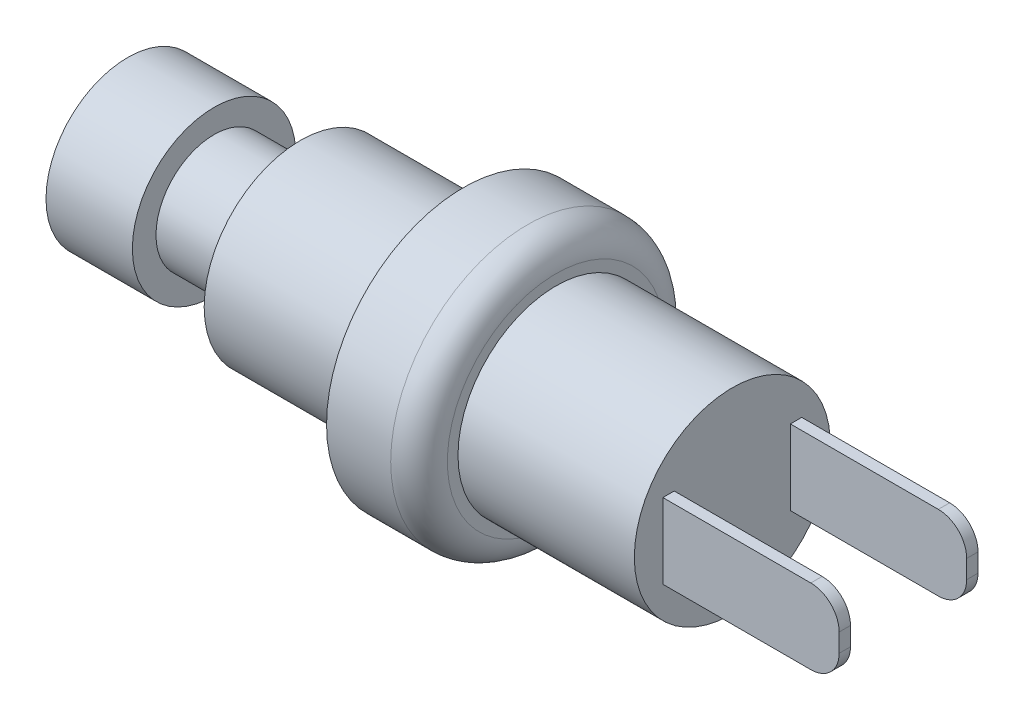
ISO-10303-21;
HEADER;
FILE_DESCRIPTION(('STEP AP214'),'2;1');
FILE_NAME('part.step','',(''),(''),'','','');
FILE_SCHEMA(('AUTOMOTIVE_DESIGN { 1 0 10303 214 1 1 1 1 }'));
ENDSEC;
DATA;
#1=APPLICATION_CONTEXT('core data for automotive mechanical design processes');
#2=APPLICATION_PROTOCOL_DEFINITION('international standard','automotive_design',2000,#1);
#3=PRODUCT_CONTEXT('',#1,'mechanical');
#4=PRODUCT('Part','Part','',(#3));
#5=PRODUCT_RELATED_PRODUCT_CATEGORY('part','',(#4));
#6=PRODUCT_DEFINITION_FORMATION('','',#4);
#7=PRODUCT_DEFINITION_CONTEXT('part definition',#1,'design');
#8=PRODUCT_DEFINITION('design','',#6,#7);
#9=PRODUCT_DEFINITION_SHAPE('','',#8);
#10=(LENGTH_UNIT() NAMED_UNIT(*) SI_UNIT(.MILLI.,.METRE.));
#11=(NAMED_UNIT(*) PLANE_ANGLE_UNIT() SI_UNIT($,.RADIAN.));
#12=(NAMED_UNIT(*) SI_UNIT($,.STERADIAN.) SOLID_ANGLE_UNIT());
#13=UNCERTAINTY_MEASURE_WITH_UNIT(LENGTH_MEASURE(1.E-05),#10,'distance_accuracy_value','');
#14=(GEOMETRIC_REPRESENTATION_CONTEXT(3) GLOBAL_UNCERTAINTY_ASSIGNED_CONTEXT((#13)) GLOBAL_UNIT_ASSIGNED_CONTEXT((#10,
#11,#12)) REPRESENTATION_CONTEXT('',''));
#15=CARTESIAN_POINT('',(0.,0.,0.));
#16=DIRECTION('',(0.,0.,1.));
#17=DIRECTION('',(1.,0.,0.));
#18=AXIS2_PLACEMENT_3D('',#15,#16,#17);
#19=CARTESIAN_POINT('',(25.1035387045972,0.,0.));
#20=DIRECTION('',(1.,0.,0.));
#21=DIRECTION('',(0.,0.,-1.));
#22=AXIS2_PLACEMENT_3D('',#19,#20,#21);
#23=PLANE('',#22);
#24=DIRECTION('',(0.,-1.,0.));
#25=VECTOR('',#24,1.);
#26=CARTESIAN_POINT('',(25.1035387045972,0.,2.05));
#27=LINE('',#26,#25);
#28=CARTESIAN_POINT('',(25.1035387045972,1.325,2.05));
#29=VERTEX_POINT('',#28);
#30=CARTESIAN_POINT('',(25.1035387045972,-1.325,2.05));
#31=VERTEX_POINT('',#30);
#32=EDGE_CURVE('E146',#29,#31,#27,.T.);
#33=ORIENTED_EDGE('',*,*,#32,.T.);
#34=DIRECTION('',(0.,0.,-1.));
#35=VECTOR('',#34,1.);
#36=CARTESIAN_POINT('',(25.1035387045972,-1.325,0.));
#37=LINE('',#36,#35);
#38=CARTESIAN_POINT('',(25.1035387045972,-1.325,2.45));
#39=VERTEX_POINT('',#38);
#40=EDGE_CURVE('E176',#39,#31,#37,.T.);
#41=ORIENTED_EDGE('',*,*,#40,.F.);
#42=DIRECTION('',(0.,-1.,0.));
#43=VECTOR('',#42,1.);
#44=CARTESIAN_POINT('',(25.1035387045972,0.,2.45));
#45=LINE('',#44,#43);
#46=CARTESIAN_POINT('',(25.1035387045972,1.325,2.45));
#47=VERTEX_POINT('',#46);
#48=EDGE_CURVE('E185',#47,#39,#45,.T.);
#49=ORIENTED_EDGE('',*,*,#48,.F.);
#50=DIRECTION('',(0.,0.,1.));
#51=VECTOR('',#50,1.);
#52=CARTESIAN_POINT('',(25.1035387045972,1.325,0.));
#53=LINE('',#52,#51);
#54=EDGE_CURVE('E182',#29,#47,#53,.T.);
#55=ORIENTED_EDGE('',*,*,#54,.F.);
#56=EDGE_LOOP('',(#33,#41,#49,#55));
#57=FACE_BOUND('',#56,.T.);
#58=CARTESIAN_POINT('',(25.1035387045972,0.,0.));
#59=DIRECTION('',(-1.,0.,0.));
#60=DIRECTION('',(0.,0.,1.));
#61=AXIS2_PLACEMENT_3D('',#58,#59,#60);
#62=CIRCLE('',#61,3.45787414617344);
#63=CARTESIAN_POINT('',(25.1035387045972,0.,3.45787414617344));
#64=VERTEX_POINT('',#63);
#65=EDGE_CURVE('E221',#64,#64,#62,.T.);
#66=ORIENTED_EDGE('',*,*,#65,.F.);
#67=EDGE_LOOP('',(#66));
#68=FACE_BOUND('',#67,.T.);
#69=DIRECTION('',(0.,-1.,0.));
#70=VECTOR('',#69,1.);
#71=CARTESIAN_POINT('',(25.1035387045972,0.,-2.05));
#72=LINE('',#71,#70);
#73=CARTESIAN_POINT('',(25.1035387045972,1.325,-2.05));
#74=VERTEX_POINT('',#73);
#75=CARTESIAN_POINT('',(25.1035387045972,-1.325,-2.05));
#76=VERTEX_POINT('',#75);
#77=EDGE_CURVE('E140',#74,#76,#72,.T.);
#78=ORIENTED_EDGE('',*,*,#77,.F.);
#79=DIRECTION('',(0.,0.,1.));
#80=VECTOR('',#79,1.);
#81=CARTESIAN_POINT('',(25.1035387045972,1.325,0.));
#82=LINE('',#81,#80);
#83=CARTESIAN_POINT('',(25.1035387045972,1.325,-2.45));
#84=VERTEX_POINT('',#83);
#85=EDGE_CURVE('E150',#84,#74,#82,.T.);
#86=ORIENTED_EDGE('',*,*,#85,.F.);
#87=DIRECTION('',(0.,1.,0.));
#88=VECTOR('',#87,1.);
#89=CARTESIAN_POINT('',(25.1035387045972,0.,-2.45));
#90=LINE('',#89,#88);
#91=CARTESIAN_POINT('',(25.1035387045972,-1.325,-2.45));
#92=VERTEX_POINT('',#91);
#93=EDGE_CURVE('E161',#92,#84,#90,.T.);
#94=ORIENTED_EDGE('',*,*,#93,.F.);
#95=DIRECTION('',(0.,0.,-1.));
#96=VECTOR('',#95,1.);
#97=CARTESIAN_POINT('',(25.1035387045972,-1.325,0.));
#98=LINE('',#97,#96);
#99=EDGE_CURVE('E159',#76,#92,#98,.T.);
#100=ORIENTED_EDGE('',*,*,#99,.F.);
#101=EDGE_LOOP('',(#78,#86,#94,#100));
#102=FACE_BOUND('',#101,.T.);
#103=ADVANCED_FACE('F46',(#57,#68,#102),#23,.T.);
#104=CARTESIAN_POINT('',(0.,0.,0.));
#105=DIRECTION('',(-1.,0.,0.));
#106=DIRECTION('',(0.,0.,1.));
#107=AXIS2_PLACEMENT_3D('',#104,#105,#106);
#108=CYLINDRICAL_SURFACE('',#107,3.45787414617344);
#109=ORIENTED_EDGE('',*,*,#65,.T.);
#110=EDGE_LOOP('',(#109));
#111=FACE_BOUND('',#110,.T.);
#112=CARTESIAN_POINT('',(18.8805387045972,0.,0.));
#113=DIRECTION('',(-1.,0.,0.));
#114=DIRECTION('',(0.,0.,1.));
#115=AXIS2_PLACEMENT_3D('',#112,#113,#114);
#116=CIRCLE('',#115,3.45787414617344);
#117=CARTESIAN_POINT('',(18.8805387045972,0.,3.45787414617344));
#118=VERTEX_POINT('',#117);
#119=EDGE_CURVE('E218',#118,#118,#116,.T.);
#120=ORIENTED_EDGE('',*,*,#119,.F.);
#121=EDGE_LOOP('',(#120));
#122=FACE_BOUND('',#121,.T.);
#123=ADVANCED_FACE('F292',(#111,#122),#108,.T.);
#124=CARTESIAN_POINT('',(18.8805387045972,0.,0.));
#125=DIRECTION('',(1.,0.,0.));
#126=DIRECTION('',(0.,0.,-1.));
#127=AXIS2_PLACEMENT_3D('',#124,#125,#126);
#128=PLANE('',#127);
#129=CARTESIAN_POINT('',(18.8805387045972,0.,0.));
#130=DIRECTION('',(1.,0.,0.));
#131=DIRECTION('',(0.,0.,-1.));
#132=AXIS2_PLACEMENT_3D('',#129,#130,#131);
#133=CIRCLE('',#132,3.832);
#134=CARTESIAN_POINT('',(18.8805387045972,0.,-3.832));
#135=VERTEX_POINT('',#134);
#136=EDGE_CURVE('E227',#135,#135,#133,.T.);
#137=ORIENTED_EDGE('',*,*,#136,.T.);
#138=EDGE_LOOP('',(#137));
#139=FACE_BOUND('',#138,.T.);
#140=ORIENTED_EDGE('',*,*,#119,.T.);
#141=EDGE_LOOP('',(#140));
#142=FACE_BOUND('',#141,.T.);
#143=ADVANCED_FACE('F297',(#139,#142),#128,.T.);
#144=CARTESIAN_POINT('',(0.,0.,0.));
#145=DIRECTION('',(-1.,0.,0.));
#146=DIRECTION('',(0.,0.,1.));
#147=AXIS2_PLACEMENT_3D('',#144,#145,#146);
#148=CYLINDRICAL_SURFACE('',#147,4.832);
#149=CARTESIAN_POINT('',(17.8805387045972,0.,0.));
#150=DIRECTION('',(1.,0.,0.));
#151=DIRECTION('',(0.,0.,-1.));
#152=AXIS2_PLACEMENT_3D('',#149,#150,#151);
#153=CIRCLE('',#152,4.832);
#154=CARTESIAN_POINT('',(17.8805387045972,0.,-4.832));
#155=VERTEX_POINT('',#154);
#156=EDGE_CURVE('E224',#155,#155,#153,.F.);
#157=ORIENTED_EDGE('',*,*,#156,.T.);
#158=EDGE_LOOP('',(#157));
#159=FACE_BOUND('',#158,.T.);
#160=CARTESIAN_POINT('',(15.6165387045972,0.,0.));
#161=DIRECTION('',(-1.,0.,0.));
#162=DIRECTION('',(0.,0.,1.));
#163=AXIS2_PLACEMENT_3D('',#160,#161,#162);
#164=CIRCLE('',#163,4.832);
#165=CARTESIAN_POINT('',(15.6165387045972,0.,4.832));
#166=VERTEX_POINT('',#165);
#167=EDGE_CURVE('E215',#166,#166,#164,.T.);
#168=ORIENTED_EDGE('',*,*,#167,.F.);
#169=EDGE_LOOP('',(#168));
#170=FACE_BOUND('',#169,.T.);
#171=ADVANCED_FACE('F438',(#159,#170),#148,.T.);
#172=CARTESIAN_POINT('',(15.6165387045972,0.,0.));
#173=DIRECTION('',(-1.,0.,0.));
#174=DIRECTION('',(0.,0.,1.));
#175=AXIS2_PLACEMENT_3D('',#172,#173,#174);
#176=PLANE('',#175);
#177=ORIENTED_EDGE('',*,*,#167,.T.);
#178=EDGE_LOOP('',(#177));
#179=FACE_BOUND('',#178,.T.);
#180=CARTESIAN_POINT('',(15.6165387045972,0.,0.));
#181=DIRECTION('',(-1.,0.,0.));
#182=DIRECTION('',(0.,0.,1.));
#183=AXIS2_PLACEMENT_3D('',#180,#181,#182);
#184=CIRCLE('',#183,3.397);
#185=CARTESIAN_POINT('',(15.6165387045972,0.,3.397));
#186=VERTEX_POINT('',#185);
#187=EDGE_CURVE('E212',#186,#186,#184,.T.);
#188=ORIENTED_EDGE('',*,*,#187,.F.);
#189=EDGE_LOOP('',(#188));
#190=FACE_BOUND('',#189,.T.);
#191=ADVANCED_FACE('F443',(#179,#190),#176,.T.);
#192=CARTESIAN_POINT('',(0.,0.,0.));
#193=DIRECTION('',(-1.,0.,0.));
#194=DIRECTION('',(0.,0.,1.));
#195=AXIS2_PLACEMENT_3D('',#192,#193,#194);
#196=CYLINDRICAL_SURFACE('',#195,3.397);
#197=ORIENTED_EDGE('',*,*,#187,.T.);
#198=EDGE_LOOP('',(#197));
#199=FACE_BOUND('',#198,.T.);
#200=CARTESIAN_POINT('',(9.86353870459718,0.,0.));
#201=DIRECTION('',(-1.,0.,0.));
#202=DIRECTION('',(0.,0.,1.));
#203=AXIS2_PLACEMENT_3D('',#200,#201,#202);
#204=CIRCLE('',#203,3.397);
#205=CARTESIAN_POINT('',(9.86353870459718,0.,3.397));
#206=VERTEX_POINT('',#205);
#207=EDGE_CURVE('E209',#206,#206,#204,.T.);
#208=ORIENTED_EDGE('',*,*,#207,.F.);
#209=EDGE_LOOP('',(#208));
#210=FACE_BOUND('',#209,.T.);
#211=ADVANCED_FACE('F508',(#199,#210),#196,.T.);
#212=CARTESIAN_POINT('',(9.86353870459718,0.,0.));
#213=DIRECTION('',(-1.,0.,0.));
#214=DIRECTION('',(0.,0.,1.));
#215=AXIS2_PLACEMENT_3D('',#212,#213,#214);
#216=PLANE('',#215);
#217=ORIENTED_EDGE('',*,*,#207,.T.);
#218=EDGE_LOOP('',(#217));
#219=FACE_BOUND('',#218,.T.);
#220=CARTESIAN_POINT('',(9.86353870459718,0.,0.));
#221=DIRECTION('',(-1.,0.,0.));
#222=DIRECTION('',(0.,0.,1.));
#223=AXIS2_PLACEMENT_3D('',#220,#221,#222);
#224=CIRCLE('',#223,2.04998570622853);
#225=CARTESIAN_POINT('',(9.86353870459718,0.,2.04998570622853));
#226=VERTEX_POINT('',#225);
#227=EDGE_CURVE('E206',#226,#226,#224,.T.);
#228=ORIENTED_EDGE('',*,*,#227,.F.);
#229=EDGE_LOOP('',(#228));
#230=FACE_BOUND('',#229,.T.);
#231=ADVANCED_FACE('F497',(#219,#230),#216,.T.);
#232=CARTESIAN_POINT('',(0.,0.,0.));
#233=DIRECTION('',(-1.,0.,0.));
#234=DIRECTION('',(0.,0.,1.));
#235=AXIS2_PLACEMENT_3D('',#232,#233,#234);
#236=CYLINDRICAL_SURFACE('',#235,2.04998570622853);
#237=ORIENTED_EDGE('',*,*,#227,.T.);
#238=EDGE_LOOP('',(#237));
#239=FACE_BOUND('',#238,.T.);
#240=CARTESIAN_POINT('',(6.81553870459718,0.,0.));
#241=DIRECTION('',(-1.,0.,0.));
#242=DIRECTION('',(0.,0.,1.));
#243=AXIS2_PLACEMENT_3D('',#240,#241,#242);
#244=CIRCLE('',#243,2.04998570622853);
#245=CARTESIAN_POINT('',(6.81553870459718,0.,2.04998570622853));
#246=VERTEX_POINT('',#245);
#247=EDGE_CURVE('E203',#246,#246,#244,.T.);
#248=ORIENTED_EDGE('',*,*,#247,.F.);
#249=EDGE_LOOP('',(#248));
#250=FACE_BOUND('',#249,.T.);
#251=ADVANCED_FACE('F487',(#239,#250),#236,.T.);
#252=CARTESIAN_POINT('',(6.81553870459718,0.,0.));
#253=DIRECTION('',(1.,0.,0.));
#254=DIRECTION('',(0.,0.,-1.));
#255=AXIS2_PLACEMENT_3D('',#252,#253,#254);
#256=PLANE('',#255);
#257=ORIENTED_EDGE('',*,*,#247,.T.);
#258=EDGE_LOOP('',(#257));
#259=FACE_BOUND('',#258,.T.);
#260=CARTESIAN_POINT('',(6.81553870459718,0.,0.));
#261=DIRECTION('',(-1.,0.,0.));
#262=DIRECTION('',(0.,0.,1.));
#263=AXIS2_PLACEMENT_3D('',#260,#261,#262);
#264=CIRCLE('',#263,2.883);
#265=CARTESIAN_POINT('',(6.81553870459718,0.,2.883));
#266=VERTEX_POINT('',#265);
#267=EDGE_CURVE('E200',#266,#266,#264,.T.);
#268=ORIENTED_EDGE('',*,*,#267,.F.);
#269=EDGE_LOOP('',(#268));
#270=FACE_BOUND('',#269,.T.);
#271=ADVANCED_FACE('F476',(#259,#270),#256,.T.);
#272=CARTESIAN_POINT('',(0.,0.,0.));
#273=DIRECTION('',(-1.,0.,0.));
#274=DIRECTION('',(0.,0.,1.));
#275=AXIS2_PLACEMENT_3D('',#272,#273,#274);
#276=CYLINDRICAL_SURFACE('',#275,2.883);
#277=ORIENTED_EDGE('',*,*,#267,.T.);
#278=EDGE_LOOP('',(#277));
#279=FACE_BOUND('',#278,.T.);
#280=CARTESIAN_POINT('',(3.76753870459718,0.,0.));
#281=DIRECTION('',(-1.,0.,0.));
#282=DIRECTION('',(0.,0.,1.));
#283=AXIS2_PLACEMENT_3D('',#280,#281,#282);
#284=CIRCLE('',#283,2.883);
#285=CARTESIAN_POINT('',(3.76753870459718,0.,2.883));
#286=VERTEX_POINT('',#285);
#287=EDGE_CURVE('E197',#286,#286,#284,.T.);
#288=ORIENTED_EDGE('',*,*,#287,.F.);
#289=EDGE_LOOP('',(#288));
#290=FACE_BOUND('',#289,.T.);
#291=ADVANCED_FACE('F465',(#279,#290),#276,.T.);
#292=CARTESIAN_POINT('',(3.76753870459718,0.,0.));
#293=DIRECTION('',(-1.,0.,0.));
#294=DIRECTION('',(0.,0.,1.));
#295=AXIS2_PLACEMENT_3D('',#292,#293,#294);
#296=PLANE('',#295);
#297=ORIENTED_EDGE('',*,*,#287,.T.);
#298=EDGE_LOOP('',(#297));
#299=FACE_BOUND('',#298,.T.);
#300=ADVANCED_FACE('F304',(#299),#296,.T.);
#301=CARTESIAN_POINT('',(17.8805387045972,0.,0.));
#302=DIRECTION('',(1.,0.,0.));
#303=DIRECTION('',(0.,0.,-1.));
#304=AXIS2_PLACEMENT_3D('',#301,#302,#303);
#305=TOROIDAL_SURFACE('',#304,3.832,1.);
#306=ORIENTED_EDGE('',*,*,#136,.F.);
#307=EDGE_LOOP('',(#306));
#308=FACE_BOUND('',#307,.T.);
#309=ORIENTED_EDGE('',*,*,#156,.F.);
#310=EDGE_LOOP('',(#309));
#311=FACE_BOUND('',#310,.T.);
#312=ADVANCED_FACE('F289',(#308,#311),#305,.T.);
#313=CARTESIAN_POINT('',(31.3235387045972,0.,2.05));
#314=DIRECTION('',(0.,0.,-1.));
#315=DIRECTION('',(-1.,0.,0.));
#316=AXIS2_PLACEMENT_3D('',#313,#314,#315);
#317=PLANE('',#316);
#318=DIRECTION('',(0.,-1.,0.));
#319=VECTOR('',#318,1.);
#320=CARTESIAN_POINT('',(31.3235387045972,0.,2.05));
#321=LINE('',#320,#319);
#322=CARTESIAN_POINT('',(31.3235387045972,0.325,2.05));
#323=VERTEX_POINT('',#322);
#324=CARTESIAN_POINT('',(31.3235387045972,-0.325,2.05));
#325=VERTEX_POINT('',#324);
#326=EDGE_CURVE('E172',#323,#325,#321,.T.);
#327=ORIENTED_EDGE('',*,*,#326,.T.);
#328=CARTESIAN_POINT('',(30.3235387045972,-0.325,2.05));
#329=DIRECTION('',(0.,0.,-1.));
#330=DIRECTION('',(-1.,0.,0.));
#331=AXIS2_PLACEMENT_3D('',#328,#329,#330);
#332=CIRCLE('',#331,1.);
#333=CARTESIAN_POINT('',(30.3235387045972,-1.325,2.05));
#334=VERTEX_POINT('',#333);
#335=EDGE_CURVE('E255',#325,#334,#332,.T.);
#336=ORIENTED_EDGE('',*,*,#335,.T.);
#337=DIRECTION('',(-1.,0.,0.));
#338=VECTOR('',#337,1.);
#339=CARTESIAN_POINT('',(31.3235387045972,-1.325,2.05));
#340=LINE('',#339,#338);
#341=EDGE_CURVE('E179',#334,#31,#340,.T.);
#342=ORIENTED_EDGE('',*,*,#341,.T.);
#343=ORIENTED_EDGE('',*,*,#32,.F.);
#344=DIRECTION('',(-1.,0.,0.));
#345=VECTOR('',#344,1.);
#346=CARTESIAN_POINT('',(31.3235387045972,1.325,2.05));
#347=LINE('',#346,#345);
#348=CARTESIAN_POINT('',(30.3235387045972,1.325,2.05));
#349=VERTEX_POINT('',#348);
#350=EDGE_CURVE('E195',#349,#29,#347,.T.);
#351=ORIENTED_EDGE('',*,*,#350,.F.);
#352=CARTESIAN_POINT('',(30.3235387045972,0.325,2.05));
#353=DIRECTION('',(0.,0.,-1.));
#354=DIRECTION('',(-1.,0.,0.));
#355=AXIS2_PLACEMENT_3D('',#352,#353,#354);
#356=CIRCLE('',#355,1.);
#357=EDGE_CURVE('E253',#349,#323,#356,.T.);
#358=ORIENTED_EDGE('',*,*,#357,.T.);
#359=EDGE_LOOP('',(#327,#336,#342,#343,#351,#358));
#360=FACE_BOUND('',#359,.T.);
#361=ADVANCED_FACE('F268',(#360),#317,.T.);
#362=CARTESIAN_POINT('',(31.3235387045972,1.325,0.));
#363=DIRECTION('',(0.,-1.,0.));
#364=DIRECTION('',(0.,0.,-1.));
#365=AXIS2_PLACEMENT_3D('',#362,#363,#364);
#366=PLANE('',#365);
#367=DIRECTION('',(-1.,0.,0.));
#368=VECTOR('',#367,1.);
#369=CARTESIAN_POINT('',(31.3235387045972,1.325,2.45));
#370=LINE('',#369,#368);
#371=CARTESIAN_POINT('',(30.3235387045972,1.325,2.45));
#372=VERTEX_POINT('',#371);
#373=EDGE_CURVE('E193',#372,#47,#370,.T.);
#374=ORIENTED_EDGE('',*,*,#373,.F.);
#375=DIRECTION('',(0.,0.,1.));
#376=VECTOR('',#375,1.);
#377=CARTESIAN_POINT('',(30.3235387045972,1.325,2.05));
#378=LINE('',#377,#376);
#379=EDGE_CURVE('E13',#372,#349,#378,.F.);
#380=ORIENTED_EDGE('',*,*,#379,.T.);
#381=ORIENTED_EDGE('',*,*,#350,.T.);
#382=ORIENTED_EDGE('',*,*,#54,.T.);
#383=EDGE_LOOP('',(#374,#380,#381,#382));
#384=FACE_BOUND('',#383,.T.);
#385=ADVANCED_FACE('F281',(#384),#366,.F.);
#386=CARTESIAN_POINT('',(31.3235387045972,0.,2.45));
#387=DIRECTION('',(0.,0.,-1.));
#388=DIRECTION('',(-1.,0.,0.));
#389=AXIS2_PLACEMENT_3D('',#386,#387,#388);
#390=PLANE('',#389);
#391=DIRECTION('',(-1.,0.,0.));
#392=VECTOR('',#391,1.);
#393=CARTESIAN_POINT('',(31.3235387045972,-1.325,2.45));
#394=LINE('',#393,#392);
#395=CARTESIAN_POINT('',(30.3235387045972,-1.325,2.45));
#396=VERTEX_POINT('',#395);
#397=EDGE_CURVE('E191',#396,#39,#394,.T.);
#398=ORIENTED_EDGE('',*,*,#397,.F.);
#399=CARTESIAN_POINT('',(30.3235387045972,-0.325,2.45));
#400=DIRECTION('',(0.,0.,-1.));
#401=DIRECTION('',(-1.,0.,0.));
#402=AXIS2_PLACEMENT_3D('',#399,#400,#401);
#403=CIRCLE('',#402,1.);
#404=CARTESIAN_POINT('',(31.3235387045972,-0.325,2.45));
#405=VERTEX_POINT('',#404);
#406=EDGE_CURVE('E54',#396,#405,#403,.F.);
#407=ORIENTED_EDGE('',*,*,#406,.T.);
#408=DIRECTION('',(0.,-1.,0.));
#409=VECTOR('',#408,1.);
#410=CARTESIAN_POINT('',(31.3235387045972,0.,2.45));
#411=LINE('',#410,#409);
#412=CARTESIAN_POINT('',(31.3235387045972,0.325,2.45));
#413=VERTEX_POINT('',#412);
#414=EDGE_CURVE('E175',#413,#405,#411,.T.);
#415=ORIENTED_EDGE('',*,*,#414,.F.);
#416=CARTESIAN_POINT('',(30.3235387045972,0.325,2.45));
#417=DIRECTION('',(0.,0.,-1.));
#418=DIRECTION('',(-1.,0.,0.));
#419=AXIS2_PLACEMENT_3D('',#416,#417,#418);
#420=CIRCLE('',#419,1.);
#421=EDGE_CURVE('E61',#413,#372,#420,.F.);
#422=ORIENTED_EDGE('',*,*,#421,.T.);
#423=ORIENTED_EDGE('',*,*,#373,.T.);
#424=ORIENTED_EDGE('',*,*,#48,.T.);
#425=EDGE_LOOP('',(#398,#407,#415,#422,#423,#424));
#426=FACE_BOUND('',#425,.T.);
#427=ADVANCED_FACE('F259',(#426),#390,.F.);
#428=CARTESIAN_POINT('',(31.3235387045972,-1.325,0.));
#429=DIRECTION('',(0.,1.,0.));
#430=DIRECTION('',(0.,0.,1.));
#431=AXIS2_PLACEMENT_3D('',#428,#429,#430);
#432=PLANE('',#431);
#433=ORIENTED_EDGE('',*,*,#341,.F.);
#434=DIRECTION('',(0.,0.,-1.));
#435=VECTOR('',#434,1.);
#436=CARTESIAN_POINT('',(30.3235387045972,-1.325,2.45));
#437=LINE('',#436,#435);
#438=EDGE_CURVE('E69',#334,#396,#437,.F.);
#439=ORIENTED_EDGE('',*,*,#438,.T.);
#440=ORIENTED_EDGE('',*,*,#397,.T.);
#441=ORIENTED_EDGE('',*,*,#40,.T.);
#442=EDGE_LOOP('',(#433,#439,#440,#441));
#443=FACE_BOUND('',#442,.T.);
#444=ADVANCED_FACE('F270',(#443),#432,.F.);
#445=CARTESIAN_POINT('',(31.3235387045972,0.,0.));
#446=DIRECTION('',(1.,0.,0.));
#447=DIRECTION('',(0.,0.,-1.));
#448=AXIS2_PLACEMENT_3D('',#445,#446,#447);
#449=PLANE('',#448);
#450=ORIENTED_EDGE('',*,*,#414,.T.);
#451=DIRECTION('',(0.,0.,-1.));
#452=VECTOR('',#451,1.);
#453=CARTESIAN_POINT('',(31.3235387045972,-0.325,2.05));
#454=LINE('',#453,#452);
#455=EDGE_CURVE('E250',#405,#325,#454,.T.);
#456=ORIENTED_EDGE('',*,*,#455,.T.);
#457=ORIENTED_EDGE('',*,*,#326,.F.);
#458=DIRECTION('',(0.,0.,1.));
#459=VECTOR('',#458,1.);
#460=CARTESIAN_POINT('',(31.3235387045972,0.325,2.45));
#461=LINE('',#460,#459);
#462=EDGE_CURVE('E247',#323,#413,#461,.T.);
#463=ORIENTED_EDGE('',*,*,#462,.T.);
#464=EDGE_LOOP('',(#450,#456,#457,#463));
#465=FACE_BOUND('',#464,.T.);
#466=ADVANCED_FACE('F263',(#465),#449,.T.);
#467=CARTESIAN_POINT('',(31.3235387045972,1.325,0.));
#468=DIRECTION('',(0.,-1.,0.));
#469=DIRECTION('',(0.,0.,-1.));
#470=AXIS2_PLACEMENT_3D('',#467,#468,#469);
#471=PLANE('',#470);
#472=DIRECTION('',(-1.,0.,0.));
#473=VECTOR('',#472,1.);
#474=CARTESIAN_POINT('',(31.3235387045972,1.325,-2.05));
#475=LINE('',#474,#473);
#476=CARTESIAN_POINT('',(30.3235387045972,1.325,-2.05));
#477=VERTEX_POINT('',#476);
#478=EDGE_CURVE('E135',#477,#74,#475,.T.);
#479=ORIENTED_EDGE('',*,*,#478,.F.);
#480=DIRECTION('',(0.,0.,1.));
#481=VECTOR('',#480,1.);
#482=CARTESIAN_POINT('',(30.3235387045972,1.325,-2.45));
#483=LINE('',#482,#481);
#484=CARTESIAN_POINT('',(30.3235387045972,1.325,-2.45));
#485=VERTEX_POINT('',#484);
#486=EDGE_CURVE('E245',#477,#485,#483,.F.);
#487=ORIENTED_EDGE('',*,*,#486,.T.);
#488=DIRECTION('',(-1.,0.,0.));
#489=VECTOR('',#488,1.);
#490=CARTESIAN_POINT('',(31.3235387045972,1.325,-2.45));
#491=LINE('',#490,#489);
#492=EDGE_CURVE('E153',#485,#84,#491,.T.);
#493=ORIENTED_EDGE('',*,*,#492,.T.);
#494=ORIENTED_EDGE('',*,*,#85,.T.);
#495=EDGE_LOOP('',(#479,#487,#493,#494));
#496=FACE_BOUND('',#495,.T.);
#497=ADVANCED_FACE('F151',(#496),#471,.F.);
#498=CARTESIAN_POINT('',(31.3235387045972,0.,-2.05));
#499=DIRECTION('',(0.,0.,-1.));
#500=DIRECTION('',(-1.,0.,0.));
#501=AXIS2_PLACEMENT_3D('',#498,#499,#500);
#502=PLANE('',#501);
#503=DIRECTION('',(-1.,0.,0.));
#504=VECTOR('',#503,1.);
#505=CARTESIAN_POINT('',(31.3235387045972,-1.325,-2.05));
#506=LINE('',#505,#504);
#507=CARTESIAN_POINT('',(30.3235387045972,-1.325,-2.05));
#508=VERTEX_POINT('',#507);
#509=EDGE_CURVE('E147',#508,#76,#506,.T.);
#510=ORIENTED_EDGE('',*,*,#509,.F.);
#511=CARTESIAN_POINT('',(30.3235387045972,-0.325,-2.05));
#512=DIRECTION('',(0.,0.,-1.));
#513=DIRECTION('',(-1.,0.,0.));
#514=AXIS2_PLACEMENT_3D('',#511,#512,#513);
#515=CIRCLE('',#514,1.);
#516=CARTESIAN_POINT('',(31.3235387045972,-0.325,-2.05));
#517=VERTEX_POINT('',#516);
#518=EDGE_CURVE('E243',#508,#517,#515,.F.);
#519=ORIENTED_EDGE('',*,*,#518,.T.);
#520=DIRECTION('',(0.,-1.,0.));
#521=VECTOR('',#520,1.);
#522=CARTESIAN_POINT('',(31.3235387045972,0.,-2.05));
#523=LINE('',#522,#521);
#524=CARTESIAN_POINT('',(31.3235387045972,0.325,-2.05));
#525=VERTEX_POINT('',#524);
#526=EDGE_CURVE('E166',#525,#517,#523,.T.);
#527=ORIENTED_EDGE('',*,*,#526,.F.);
#528=CARTESIAN_POINT('',(30.3235387045972,0.325,-2.05));
#529=DIRECTION('',(0.,0.,-1.));
#530=DIRECTION('',(-1.,0.,0.));
#531=AXIS2_PLACEMENT_3D('',#528,#529,#530);
#532=CIRCLE('',#531,1.);
#533=EDGE_CURVE('E143',#525,#477,#532,.F.);
#534=ORIENTED_EDGE('',*,*,#533,.T.);
#535=ORIENTED_EDGE('',*,*,#478,.T.);
#536=ORIENTED_EDGE('',*,*,#77,.T.);
#537=EDGE_LOOP('',(#510,#519,#527,#534,#535,#536));
#538=FACE_BOUND('',#537,.T.);
#539=ADVANCED_FACE('F138',(#538),#502,.F.);
#540=CARTESIAN_POINT('',(31.3235387045972,-1.325,0.));
#541=DIRECTION('',(0.,1.,0.));
#542=DIRECTION('',(0.,0.,1.));
#543=AXIS2_PLACEMENT_3D('',#540,#541,#542);
#544=PLANE('',#543);
#545=DIRECTION('',(-1.,0.,0.));
#546=VECTOR('',#545,1.);
#547=CARTESIAN_POINT('',(31.3235387045972,-1.325,-2.45));
#548=LINE('',#547,#546);
#549=CARTESIAN_POINT('',(30.3235387045972,-1.325,-2.45));
#550=VERTEX_POINT('',#549);
#551=EDGE_CURVE('E168',#550,#92,#548,.T.);
#552=ORIENTED_EDGE('',*,*,#551,.F.);
#553=DIRECTION('',(0.,0.,-1.));
#554=VECTOR('',#553,1.);
#555=CARTESIAN_POINT('',(30.3235387045972,-1.325,-2.05));
#556=LINE('',#555,#554);
#557=EDGE_CURVE('E240',#550,#508,#556,.F.);
#558=ORIENTED_EDGE('',*,*,#557,.T.);
#559=ORIENTED_EDGE('',*,*,#509,.T.);
#560=ORIENTED_EDGE('',*,*,#99,.T.);
#561=EDGE_LOOP('',(#552,#558,#559,#560));
#562=FACE_BOUND('',#561,.T.);
#563=ADVANCED_FACE('F355',(#562),#544,.F.);
#564=CARTESIAN_POINT('',(31.3235387045972,0.,-2.45));
#565=DIRECTION('',(0.,0.,1.));
#566=DIRECTION('',(1.,0.,0.));
#567=AXIS2_PLACEMENT_3D('',#564,#565,#566);
#568=PLANE('',#567);
#569=DIRECTION('',(0.,1.,0.));
#570=VECTOR('',#569,1.);
#571=CARTESIAN_POINT('',(31.3235387045972,0.,-2.45));
#572=LINE('',#571,#570);
#573=CARTESIAN_POINT('',(31.3235387045972,-0.325,-2.45));
#574=VERTEX_POINT('',#573);
#575=CARTESIAN_POINT('',(31.3235387045972,0.325,-2.45));
#576=VERTEX_POINT('',#575);
#577=EDGE_CURVE('E169',#574,#576,#572,.T.);
#578=ORIENTED_EDGE('',*,*,#577,.F.);
#579=CARTESIAN_POINT('',(30.3235387045972,-0.325,-2.45));
#580=DIRECTION('',(0.,0.,1.));
#581=DIRECTION('',(1.,0.,0.));
#582=AXIS2_PLACEMENT_3D('',#579,#580,#581);
#583=CIRCLE('',#582,1.);
#584=EDGE_CURVE('E238',#574,#550,#583,.F.);
#585=ORIENTED_EDGE('',*,*,#584,.T.);
#586=ORIENTED_EDGE('',*,*,#551,.T.);
#587=ORIENTED_EDGE('',*,*,#93,.T.);
#588=ORIENTED_EDGE('',*,*,#492,.F.);
#589=CARTESIAN_POINT('',(30.3235387045972,0.325,-2.45));
#590=DIRECTION('',(0.,0.,1.));
#591=DIRECTION('',(1.,0.,0.));
#592=AXIS2_PLACEMENT_3D('',#589,#590,#591);
#593=CIRCLE('',#592,1.);
#594=EDGE_CURVE('E236',#485,#576,#593,.F.);
#595=ORIENTED_EDGE('',*,*,#594,.T.);
#596=EDGE_LOOP('',(#578,#585,#586,#587,#588,#595));
#597=FACE_BOUND('',#596,.T.);
#598=ADVANCED_FACE('F345',(#597),#568,.F.);
#599=CARTESIAN_POINT('',(31.3235387045972,0.,0.));
#600=DIRECTION('',(1.,0.,0.));
#601=DIRECTION('',(0.,0.,-1.));
#602=AXIS2_PLACEMENT_3D('',#599,#600,#601);
#603=PLANE('',#602);
#604=ORIENTED_EDGE('',*,*,#526,.T.);
#605=DIRECTION('',(0.,0.,-1.));
#606=VECTOR('',#605,1.);
#607=CARTESIAN_POINT('',(31.3235387045972,-0.325,-2.45));
#608=LINE('',#607,#606);
#609=EDGE_CURVE('E233',#517,#574,#608,.T.);
#610=ORIENTED_EDGE('',*,*,#609,.T.);
#611=ORIENTED_EDGE('',*,*,#577,.T.);
#612=DIRECTION('',(0.,0.,1.));
#613=VECTOR('',#612,1.);
#614=CARTESIAN_POINT('',(31.3235387045972,0.325,-2.05));
#615=LINE('',#614,#613);
#616=EDGE_CURVE('E230',#576,#525,#615,.T.);
#617=ORIENTED_EDGE('',*,*,#616,.T.);
#618=EDGE_LOOP('',(#604,#610,#611,#617));
#619=FACE_BOUND('',#618,.T.);
#620=ADVANCED_FACE('F310',(#619),#603,.T.);
#621=CARTESIAN_POINT('',(30.3235387045972,-0.325,0.));
#622=DIRECTION('',(0.,0.,1.));
#623=DIRECTION('',(0.,-1.,0.));
#624=AXIS2_PLACEMENT_3D('',#621,#622,#623);
#625=CYLINDRICAL_SURFACE('',#624,1.);
#626=ORIENTED_EDGE('',*,*,#518,.F.);
#627=ORIENTED_EDGE('',*,*,#557,.F.);
#628=ORIENTED_EDGE('',*,*,#584,.F.);
#629=ORIENTED_EDGE('',*,*,#609,.F.);
#630=EDGE_LOOP('',(#626,#627,#628,#629));
#631=FACE_BOUND('',#630,.T.);
#632=ADVANCED_FACE('F306',(#631),#625,.T.);
#633=CARTESIAN_POINT('',(30.3235387045972,0.325,0.));
#634=DIRECTION('',(0.,0.,-1.));
#635=DIRECTION('',(-1.,0.,0.));
#636=AXIS2_PLACEMENT_3D('',#633,#634,#635);
#637=CYLINDRICAL_SURFACE('',#636,1.);
#638=ORIENTED_EDGE('',*,*,#594,.F.);
#639=ORIENTED_EDGE('',*,*,#486,.F.);
#640=ORIENTED_EDGE('',*,*,#533,.F.);
#641=ORIENTED_EDGE('',*,*,#616,.F.);
#642=EDGE_LOOP('',(#638,#639,#640,#641));
#643=FACE_BOUND('',#642,.T.);
#644=ADVANCED_FACE('F309',(#643),#637,.T.);
#645=CARTESIAN_POINT('',(30.3235387045972,-0.325,0.));
#646=DIRECTION('',(0.,0.,1.));
#647=DIRECTION('',(0.,-1.,0.));
#648=AXIS2_PLACEMENT_3D('',#645,#646,#647);
#649=CYLINDRICAL_SURFACE('',#648,1.);
#650=ORIENTED_EDGE('',*,*,#406,.F.);
#651=ORIENTED_EDGE('',*,*,#438,.F.);
#652=ORIENTED_EDGE('',*,*,#335,.F.);
#653=ORIENTED_EDGE('',*,*,#455,.F.);
#654=EDGE_LOOP('',(#650,#651,#652,#653));
#655=FACE_BOUND('',#654,.T.);
#656=ADVANCED_FACE('F266',(#655),#649,.T.);
#657=CARTESIAN_POINT('',(30.3235387045972,0.325,0.));
#658=DIRECTION('',(0.,0.,-1.));
#659=DIRECTION('',(-1.,0.,0.));
#660=AXIS2_PLACEMENT_3D('',#657,#658,#659);
#661=CYLINDRICAL_SURFACE('',#660,1.);
#662=ORIENTED_EDGE('',*,*,#357,.F.);
#663=ORIENTED_EDGE('',*,*,#379,.F.);
#664=ORIENTED_EDGE('',*,*,#421,.F.);
#665=ORIENTED_EDGE('',*,*,#462,.F.);
#666=EDGE_LOOP('',(#662,#663,#664,#665));
#667=FACE_BOUND('',#666,.T.);
#668=ADVANCED_FACE('F48',(#667),#661,.T.);
#669=CLOSED_SHELL('',(#103,#123,#143,#171,#191,#211,#231,#251,#271,#291,#300,#312,#361,#385,
#427,#444,#466,#497,#539,#563,#598,#620,#632,#644,#656,#668));
#670=MANIFOLD_SOLID_BREP('B2',#669);
#671=ADVANCED_BREP_SHAPE_REPRESENTATION('',(#18,#670),#14);
#672=SHAPE_DEFINITION_REPRESENTATION(#9,#671);
ENDSEC;
END-ISO-10303-21;
